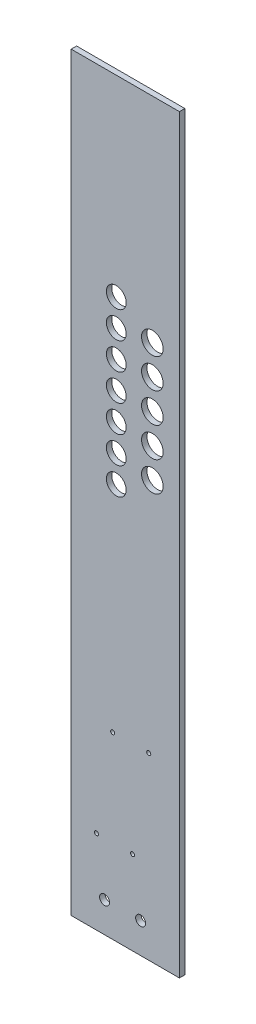
ISO-10303-21;
HEADER;
FILE_DESCRIPTION(('STEP AP214'),'2;1');
FILE_NAME('part.step','',(''),(''),'','','');
FILE_SCHEMA(('AUTOMOTIVE_DESIGN { 1 0 10303 214 1 1 1 1 }'));
ENDSEC;
DATA;
#1=APPLICATION_CONTEXT('core data for automotive mechanical design processes');
#2=APPLICATION_PROTOCOL_DEFINITION('international standard','automotive_design',2000,#1);
#3=PRODUCT_CONTEXT('',#1,'mechanical');
#4=PRODUCT('Part','Part','',(#3));
#5=PRODUCT_RELATED_PRODUCT_CATEGORY('part','',(#4));
#6=PRODUCT_DEFINITION_FORMATION('','',#4);
#7=PRODUCT_DEFINITION_CONTEXT('part definition',#1,'design');
#8=PRODUCT_DEFINITION('design','',#6,#7);
#9=PRODUCT_DEFINITION_SHAPE('','',#8);
#10=(LENGTH_UNIT() NAMED_UNIT(*) SI_UNIT(.MILLI.,.METRE.));
#11=(NAMED_UNIT(*) PLANE_ANGLE_UNIT() SI_UNIT($,.RADIAN.));
#12=(NAMED_UNIT(*) SI_UNIT($,.STERADIAN.) SOLID_ANGLE_UNIT());
#13=UNCERTAINTY_MEASURE_WITH_UNIT(LENGTH_MEASURE(1.E-05),#10,'distance_accuracy_value','');
#14=(GEOMETRIC_REPRESENTATION_CONTEXT(3) GLOBAL_UNCERTAINTY_ASSIGNED_CONTEXT((#13)) GLOBAL_UNIT_ASSIGNED_CONTEXT((#10,
#11,#12)) REPRESENTATION_CONTEXT('',''));
#15=CARTESIAN_POINT('',(0.,0.,0.));
#16=DIRECTION('',(0.,0.,1.));
#17=DIRECTION('',(1.,0.,0.));
#18=AXIS2_PLACEMENT_3D('',#15,#16,#17);
#19=CARTESIAN_POINT('',(60.,-416.,6.));
#20=DIRECTION('',(-1.,0.,0.));
#21=DIRECTION('',(0.,0.,1.));
#22=AXIS2_PLACEMENT_3D('',#19,#20,#21);
#23=PLANE('',#22);
#24=DIRECTION('',(0.,1.,0.));
#25=VECTOR('',#24,1.);
#26=CARTESIAN_POINT('',(60.,-416.,0.));
#27=LINE('',#26,#25);
#28=CARTESIAN_POINT('',(60.,-416.,0.));
#29=VERTEX_POINT('',#28);
#30=CARTESIAN_POINT('',(60.,416.,0.));
#31=VERTEX_POINT('',#30);
#32=EDGE_CURVE('E102',#29,#31,#27,.T.);
#33=ORIENTED_EDGE('',*,*,#32,.T.);
#34=DIRECTION('',(0.,0.,-1.));
#35=VECTOR('',#34,1.);
#36=CARTESIAN_POINT('',(60.,416.,6.));
#37=LINE('',#36,#35);
#38=CARTESIAN_POINT('',(60.,416.,6.));
#39=VERTEX_POINT('',#38);
#40=EDGE_CURVE('E93',#39,#31,#37,.T.);
#41=ORIENTED_EDGE('',*,*,#40,.F.);
#42=DIRECTION('',(0.,1.,0.));
#43=VECTOR('',#42,1.);
#44=CARTESIAN_POINT('',(60.,-416.,6.));
#45=LINE('',#44,#43);
#46=CARTESIAN_POINT('',(60.,-416.,6.));
#47=VERTEX_POINT('',#46);
#48=EDGE_CURVE('E87',#47,#39,#45,.T.);
#49=ORIENTED_EDGE('',*,*,#48,.F.);
#50=DIRECTION('',(0.,0.,-1.));
#51=VECTOR('',#50,1.);
#52=CARTESIAN_POINT('',(60.,-416.,6.));
#53=LINE('',#52,#51);
#54=EDGE_CURVE('E98',#47,#29,#53,.T.);
#55=ORIENTED_EDGE('',*,*,#54,.T.);
#56=EDGE_LOOP('',(#33,#41,#49,#55));
#57=FACE_BOUND('',#56,.T.);
#58=ADVANCED_FACE('F33',(#57),#23,.F.);
#59=CARTESIAN_POINT('',(-60.,416.,6.));
#60=DIRECTION('',(0.,-1.,0.));
#61=DIRECTION('',(0.,0.,-1.));
#62=AXIS2_PLACEMENT_3D('',#59,#60,#61);
#63=PLANE('',#62);
#64=DIRECTION('',(-1.,0.,0.));
#65=VECTOR('',#64,1.);
#66=CARTESIAN_POINT('',(-60.,416.,0.));
#67=LINE('',#66,#65);
#68=CARTESIAN_POINT('',(-60.,416.,0.));
#69=VERTEX_POINT('',#68);
#70=EDGE_CURVE('E92',#31,#69,#67,.T.);
#71=ORIENTED_EDGE('',*,*,#70,.T.);
#72=DIRECTION('',(0.,0.,-1.));
#73=VECTOR('',#72,1.);
#74=CARTESIAN_POINT('',(-60.,416.,6.));
#75=LINE('',#74,#73);
#76=CARTESIAN_POINT('',(-60.,416.,6.));
#77=VERTEX_POINT('',#76);
#78=EDGE_CURVE('E90',#77,#69,#75,.T.);
#79=ORIENTED_EDGE('',*,*,#78,.F.);
#80=DIRECTION('',(-1.,0.,0.));
#81=VECTOR('',#80,1.);
#82=CARTESIAN_POINT('',(-60.,416.,6.));
#83=LINE('',#82,#81);
#84=EDGE_CURVE('E81',#39,#77,#83,.T.);
#85=ORIENTED_EDGE('',*,*,#84,.F.);
#86=ORIENTED_EDGE('',*,*,#40,.T.);
#87=EDGE_LOOP('',(#71,#79,#85,#86));
#88=FACE_BOUND('',#87,.T.);
#89=ADVANCED_FACE('F91',(#88),#63,.F.);
#90=CARTESIAN_POINT('',(-60.,-416.,6.));
#91=DIRECTION('',(1.,0.,0.));
#92=DIRECTION('',(0.,0.,-1.));
#93=AXIS2_PLACEMENT_3D('',#90,#91,#92);
#94=PLANE('',#93);
#95=DIRECTION('',(0.,-1.,0.));
#96=VECTOR('',#95,1.);
#97=CARTESIAN_POINT('',(-60.,-416.,0.));
#98=LINE('',#97,#96);
#99=CARTESIAN_POINT('',(-60.,-416.,0.));
#100=VERTEX_POINT('',#99);
#101=EDGE_CURVE('E67',#69,#100,#98,.T.);
#102=ORIENTED_EDGE('',*,*,#101,.T.);
#103=DIRECTION('',(0.,0.,-1.));
#104=VECTOR('',#103,1.);
#105=CARTESIAN_POINT('',(-60.,-416.,6.));
#106=LINE('',#105,#104);
#107=CARTESIAN_POINT('',(-60.,-416.,6.));
#108=VERTEX_POINT('',#107);
#109=EDGE_CURVE('E94',#108,#100,#106,.T.);
#110=ORIENTED_EDGE('',*,*,#109,.F.);
#111=DIRECTION('',(0.,-1.,0.));
#112=VECTOR('',#111,1.);
#113=CARTESIAN_POINT('',(-60.,-416.,6.));
#114=LINE('',#113,#112);
#115=EDGE_CURVE('E85',#77,#108,#114,.T.);
#116=ORIENTED_EDGE('',*,*,#115,.F.);
#117=ORIENTED_EDGE('',*,*,#78,.T.);
#118=EDGE_LOOP('',(#102,#110,#116,#117));
#119=FACE_BOUND('',#118,.T.);
#120=ADVANCED_FACE('F96',(#119),#94,.F.);
#121=CARTESIAN_POINT('',(-60.,-416.,6.));
#122=DIRECTION('',(0.,1.,0.));
#123=DIRECTION('',(0.,0.,1.));
#124=AXIS2_PLACEMENT_3D('',#121,#122,#123);
#125=PLANE('',#124);
#126=DIRECTION('',(1.,0.,0.));
#127=VECTOR('',#126,1.);
#128=CARTESIAN_POINT('',(-60.,-416.,0.));
#129=LINE('',#128,#127);
#130=EDGE_CURVE('E73',#100,#29,#129,.T.);
#131=ORIENTED_EDGE('',*,*,#130,.T.);
#132=ORIENTED_EDGE('',*,*,#54,.F.);
#133=DIRECTION('',(1.,0.,0.));
#134=VECTOR('',#133,1.);
#135=CARTESIAN_POINT('',(-60.,-416.,6.));
#136=LINE('',#135,#134);
#137=EDGE_CURVE('E50',#108,#47,#136,.T.);
#138=ORIENTED_EDGE('',*,*,#137,.F.);
#139=ORIENTED_EDGE('',*,*,#109,.T.);
#140=EDGE_LOOP('',(#131,#132,#138,#139));
#141=FACE_BOUND('',#140,.T.);
#142=ADVANCED_FACE('F152',(#141),#125,.F.);
#143=CARTESIAN_POINT('',(0.,0.,6.));
#144=DIRECTION('',(0.,0.,-1.));
#145=DIRECTION('',(-1.,0.,0.));
#146=AXIS2_PLACEMENT_3D('',#143,#144,#145);
#147=PLANE('',#146);
#148=CARTESIAN_POINT('',(-9.99999999999998,83.,6.));
#149=DIRECTION('',(0.,0.,1.));
#150=DIRECTION('',(1.,0.,0.));
#151=AXIS2_PLACEMENT_3D('',#148,#149,#150);
#152=CIRCLE('',#151,11.);
#153=CARTESIAN_POINT('',(1.00000000000001,83.,6.));
#154=VERTEX_POINT('',#153);
#155=EDGE_CURVE('E323',#154,#154,#152,.T.);
#156=ORIENTED_EDGE('',*,*,#155,.F.);
#157=EDGE_LOOP('',(#156));
#158=FACE_BOUND('',#157,.T.);
#159=CARTESIAN_POINT('',(30.0000000000001,80.,6.));
#160=DIRECTION('',(0.,0.,1.));
#161=DIRECTION('',(1.,0.,0.));
#162=AXIS2_PLACEMENT_3D('',#159,#160,#161);
#163=CIRCLE('',#162,12.);
#164=CARTESIAN_POINT('',(42.0000000000001,80.,6.));
#165=VERTEX_POINT('',#164);
#166=EDGE_CURVE('E317',#165,#165,#163,.T.);
#167=ORIENTED_EDGE('',*,*,#166,.F.);
#168=EDGE_LOOP('',(#167));
#169=FACE_BOUND('',#168,.T.);
#170=CARTESIAN_POINT('',(30.0000000000001,146.,6.));
#171=DIRECTION('',(0.,0.,1.));
#172=DIRECTION('',(1.,0.,0.));
#173=AXIS2_PLACEMENT_3D('',#170,#171,#172);
#174=CIRCLE('',#173,12.);
#175=CARTESIAN_POINT('',(42.0000000000001,146.,6.));
#176=VERTEX_POINT('',#175);
#177=EDGE_CURVE('E311',#176,#176,#174,.T.);
#178=ORIENTED_EDGE('',*,*,#177,.F.);
#179=EDGE_LOOP('',(#178));
#180=FACE_BOUND('',#179,.T.);
#181=CARTESIAN_POINT('',(-9.99999999999998,143.,6.));
#182=DIRECTION('',(0.,0.,1.));
#183=DIRECTION('',(1.,0.,0.));
#184=AXIS2_PLACEMENT_3D('',#181,#182,#183);
#185=CIRCLE('',#184,11.);
#186=CARTESIAN_POINT('',(1.00000000000001,143.,6.));
#187=VERTEX_POINT('',#186);
#188=EDGE_CURVE('E305',#187,#187,#185,.T.);
#189=ORIENTED_EDGE('',*,*,#188,.F.);
#190=EDGE_LOOP('',(#189));
#191=FACE_BOUND('',#190,.T.);
#192=CARTESIAN_POINT('',(30.0000000000001,113.,6.));
#193=DIRECTION('',(0.,0.,1.));
#194=DIRECTION('',(1.,0.,0.));
#195=AXIS2_PLACEMENT_3D('',#192,#193,#194);
#196=CIRCLE('',#195,12.);
#197=CARTESIAN_POINT('',(42.0000000000001,113.,6.));
#198=VERTEX_POINT('',#197);
#199=EDGE_CURVE('E302',#198,#198,#196,.T.);
#200=ORIENTED_EDGE('',*,*,#199,.F.);
#201=EDGE_LOOP('',(#200));
#202=FACE_BOUND('',#201,.T.);
#203=CARTESIAN_POINT('',(-9.99999999999998,113.,6.));
#204=DIRECTION('',(0.,0.,1.));
#205=DIRECTION('',(1.,0.,0.));
#206=AXIS2_PLACEMENT_3D('',#203,#204,#205);
#207=CIRCLE('',#206,11.);
#208=CARTESIAN_POINT('',(1.00000000000001,113.,6.));
#209=VERTEX_POINT('',#208);
#210=EDGE_CURVE('E296',#209,#209,#207,.T.);
#211=ORIENTED_EDGE('',*,*,#210,.F.);
#212=EDGE_LOOP('',(#211));
#213=FACE_BOUND('',#212,.T.);
#214=CARTESIAN_POINT('',(26.000000000195,-217.000000000244,6.));
#215=DIRECTION('',(0.,0.,1.));
#216=DIRECTION('',(1.,0.,0.));
#217=AXIS2_PLACEMENT_3D('',#214,#215,#216);
#218=CIRCLE('',#217,2.25);
#219=CARTESIAN_POINT('',(28.250000000195,-217.000000000244,6.));
#220=VERTEX_POINT('',#219);
#221=EDGE_CURVE('E290',#220,#220,#218,.T.);
#222=ORIENTED_EDGE('',*,*,#221,.F.);
#223=EDGE_LOOP('',(#222));
#224=FACE_BOUND('',#223,.T.);
#225=CARTESIAN_POINT('',(8.00000000019505,-323.000000000244,6.));
#226=DIRECTION('',(0.,0.,1.));
#227=DIRECTION('',(1.,0.,0.));
#228=AXIS2_PLACEMENT_3D('',#225,#226,#227);
#229=CIRCLE('',#228,2.25);
#230=CARTESIAN_POINT('',(10.2500000001951,-323.000000000244,6.));
#231=VERTEX_POINT('',#230);
#232=EDGE_CURVE('E284',#231,#231,#229,.T.);
#233=ORIENTED_EDGE('',*,*,#232,.F.);
#234=EDGE_LOOP('',(#233));
#235=FACE_BOUND('',#234,.T.);
#236=CARTESIAN_POINT('',(-31.9999999998049,-323.000000000244,6.));
#237=DIRECTION('',(0.,0.,1.));
#238=DIRECTION('',(1.,0.,0.));
#239=AXIS2_PLACEMENT_3D('',#236,#237,#238);
#240=CIRCLE('',#239,2.25);
#241=CARTESIAN_POINT('',(-29.7499999998049,-323.000000000244,6.));
#242=VERTEX_POINT('',#241);
#243=EDGE_CURVE('E278',#242,#242,#240,.T.);
#244=ORIENTED_EDGE('',*,*,#243,.F.);
#245=EDGE_LOOP('',(#244));
#246=FACE_BOUND('',#245,.T.);
#247=CARTESIAN_POINT('',(-13.999999999805,-217.000000000244,6.));
#248=DIRECTION('',(0.,0.,1.));
#249=DIRECTION('',(1.,0.,0.));
#250=AXIS2_PLACEMENT_3D('',#247,#248,#249);
#251=CIRCLE('',#250,2.25);
#252=CARTESIAN_POINT('',(-11.749999999805,-217.000000000244,6.));
#253=VERTEX_POINT('',#252);
#254=EDGE_CURVE('E272',#253,#253,#251,.T.);
#255=ORIENTED_EDGE('',*,*,#254,.F.);
#256=EDGE_LOOP('',(#255));
#257=FACE_BOUND('',#256,.T.);
#258=CARTESIAN_POINT('',(17.000000000195,-382.348938989168,6.));
#259=DIRECTION('',(0.,0.,1.));
#260=DIRECTION('',(1.,0.,0.));
#261=AXIS2_PLACEMENT_3D('',#258,#259,#260);
#262=CIRCLE('',#261,5.5);
#263=CARTESIAN_POINT('',(22.500000000195,-382.348938989168,6.));
#264=VERTEX_POINT('',#263);
#265=EDGE_CURVE('E264',#264,#264,#262,.T.);
#266=ORIENTED_EDGE('',*,*,#265,.F.);
#267=EDGE_LOOP('',(#266));
#268=FACE_BOUND('',#267,.T.);
#269=CARTESIAN_POINT('',(-22.999999999805,-382.348938989168,6.));
#270=DIRECTION('',(0.,0.,1.));
#271=DIRECTION('',(1.,0.,0.));
#272=AXIS2_PLACEMENT_3D('',#269,#270,#271);
#273=CIRCLE('',#272,5.5);
#274=CARTESIAN_POINT('',(-17.499999999805,-382.348938989168,6.));
#275=VERTEX_POINT('',#274);
#276=EDGE_CURVE('E258',#275,#275,#273,.T.);
#277=ORIENTED_EDGE('',*,*,#276,.F.);
#278=EDGE_LOOP('',(#277));
#279=FACE_BOUND('',#278,.T.);
#280=ORIENTED_EDGE('',*,*,#48,.T.);
#281=ORIENTED_EDGE('',*,*,#84,.T.);
#282=ORIENTED_EDGE('',*,*,#115,.T.);
#283=ORIENTED_EDGE('',*,*,#137,.T.);
#284=EDGE_LOOP('',(#280,#281,#282,#283));
#285=FACE_BOUND('',#284,.T.);
#286=CARTESIAN_POINT('',(-9.99999999999998,173.,6.));
#287=DIRECTION('',(0.,0.,1.));
#288=DIRECTION('',(1.,0.,0.));
#289=AXIS2_PLACEMENT_3D('',#286,#287,#288);
#290=CIRCLE('',#289,11.);
#291=CARTESIAN_POINT('',(1.00000000000001,173.,6.));
#292=VERTEX_POINT('',#291);
#293=EDGE_CURVE('E115',#292,#292,#290,.T.);
#294=ORIENTED_EDGE('',*,*,#293,.F.);
#295=EDGE_LOOP('',(#294));
#296=FACE_BOUND('',#295,.T.);
#297=CARTESIAN_POINT('',(-9.99999999999998,203.,6.));
#298=DIRECTION('',(0.,0.,1.));
#299=DIRECTION('',(1.,0.,0.));
#300=AXIS2_PLACEMENT_3D('',#297,#298,#299);
#301=CIRCLE('',#300,11.);
#302=CARTESIAN_POINT('',(1.00000000000001,203.,6.));
#303=VERTEX_POINT('',#302);
#304=EDGE_CURVE('E121',#303,#303,#301,.T.);
#305=ORIENTED_EDGE('',*,*,#304,.F.);
#306=EDGE_LOOP('',(#305));
#307=FACE_BOUND('',#306,.T.);
#308=CARTESIAN_POINT('',(30.0000000000001,179.,6.));
#309=DIRECTION('',(0.,0.,1.));
#310=DIRECTION('',(1.,0.,0.));
#311=AXIS2_PLACEMENT_3D('',#308,#309,#310);
#312=CIRCLE('',#311,12.);
#313=CARTESIAN_POINT('',(42.0000000000001,179.,6.));
#314=VERTEX_POINT('',#313);
#315=EDGE_CURVE('E127',#314,#314,#312,.T.);
#316=ORIENTED_EDGE('',*,*,#315,.F.);
#317=EDGE_LOOP('',(#316));
#318=FACE_BOUND('',#317,.T.);
#319=CARTESIAN_POINT('',(30.0000000000001,47.,6.));
#320=DIRECTION('',(0.,0.,1.));
#321=DIRECTION('',(1.,0.,0.));
#322=AXIS2_PLACEMENT_3D('',#319,#320,#321);
#323=CIRCLE('',#322,12.);
#324=CARTESIAN_POINT('',(42.0000000000001,47.,6.));
#325=VERTEX_POINT('',#324);
#326=EDGE_CURVE('E133',#325,#325,#323,.T.);
#327=ORIENTED_EDGE('',*,*,#326,.F.);
#328=EDGE_LOOP('',(#327));
#329=FACE_BOUND('',#328,.T.);
#330=CARTESIAN_POINT('',(-9.99999999999998,53.,6.));
#331=DIRECTION('',(0.,0.,1.));
#332=DIRECTION('',(1.,0.,0.));
#333=AXIS2_PLACEMENT_3D('',#330,#331,#332);
#334=CIRCLE('',#333,11.);
#335=CARTESIAN_POINT('',(1.00000000000001,53.,6.));
#336=VERTEX_POINT('',#335);
#337=EDGE_CURVE('E139',#336,#336,#334,.T.);
#338=ORIENTED_EDGE('',*,*,#337,.F.);
#339=EDGE_LOOP('',(#338));
#340=FACE_BOUND('',#339,.T.);
#341=CARTESIAN_POINT('',(-9.99999999999998,23.,6.));
#342=DIRECTION('',(0.,0.,1.));
#343=DIRECTION('',(1.,0.,0.));
#344=AXIS2_PLACEMENT_3D('',#341,#342,#343);
#345=CIRCLE('',#344,11.);
#346=CARTESIAN_POINT('',(1.00000000000001,23.,6.));
#347=VERTEX_POINT('',#346);
#348=EDGE_CURVE('E11',#347,#347,#345,.T.);
#349=ORIENTED_EDGE('',*,*,#348,.F.);
#350=EDGE_LOOP('',(#349));
#351=FACE_BOUND('',#350,.T.);
#352=ADVANCED_FACE('F82',(#158,#169,#180,#191,#202,#213,#224,#235,#246,#257,#268,#279,#285,#296,
#307,#318,#329,#340,#351),#147,.F.);
#353=CARTESIAN_POINT('',(0.,0.,0.));
#354=DIRECTION('',(0.,0.,-1.));
#355=DIRECTION('',(-1.,0.,0.));
#356=AXIS2_PLACEMENT_3D('',#353,#354,#355);
#357=PLANE('',#356);
#358=CARTESIAN_POINT('',(-9.99999999999998,83.,0.));
#359=DIRECTION('',(0.,0.,1.));
#360=DIRECTION('',(1.,0.,0.));
#361=AXIS2_PLACEMENT_3D('',#358,#359,#360);
#362=CIRCLE('',#361,11.);
#363=CARTESIAN_POINT('',(1.00000000000001,83.,0.));
#364=VERTEX_POINT('',#363);
#365=EDGE_CURVE('E326',#364,#364,#362,.T.);
#366=ORIENTED_EDGE('',*,*,#365,.T.);
#367=EDGE_LOOP('',(#366));
#368=FACE_BOUND('',#367,.T.);
#369=CARTESIAN_POINT('',(30.0000000000001,80.,0.));
#370=DIRECTION('',(0.,0.,1.));
#371=DIRECTION('',(1.,0.,0.));
#372=AXIS2_PLACEMENT_3D('',#369,#370,#371);
#373=CIRCLE('',#372,12.);
#374=CARTESIAN_POINT('',(42.0000000000001,80.,0.));
#375=VERTEX_POINT('',#374);
#376=EDGE_CURVE('E320',#375,#375,#373,.T.);
#377=ORIENTED_EDGE('',*,*,#376,.T.);
#378=EDGE_LOOP('',(#377));
#379=FACE_BOUND('',#378,.T.);
#380=CARTESIAN_POINT('',(30.0000000000001,146.,0.));
#381=DIRECTION('',(0.,0.,1.));
#382=DIRECTION('',(1.,0.,0.));
#383=AXIS2_PLACEMENT_3D('',#380,#381,#382);
#384=CIRCLE('',#383,12.);
#385=CARTESIAN_POINT('',(42.0000000000001,146.,0.));
#386=VERTEX_POINT('',#385);
#387=EDGE_CURVE('E314',#386,#386,#384,.T.);
#388=ORIENTED_EDGE('',*,*,#387,.T.);
#389=EDGE_LOOP('',(#388));
#390=FACE_BOUND('',#389,.T.);
#391=CARTESIAN_POINT('',(-9.99999999999998,143.,0.));
#392=DIRECTION('',(0.,0.,1.));
#393=DIRECTION('',(1.,0.,0.));
#394=AXIS2_PLACEMENT_3D('',#391,#392,#393);
#395=CIRCLE('',#394,11.);
#396=CARTESIAN_POINT('',(1.00000000000001,143.,0.));
#397=VERTEX_POINT('',#396);
#398=EDGE_CURVE('E308',#397,#397,#395,.T.);
#399=ORIENTED_EDGE('',*,*,#398,.T.);
#400=EDGE_LOOP('',(#399));
#401=FACE_BOUND('',#400,.T.);
#402=CARTESIAN_POINT('',(30.0000000000001,113.,0.));
#403=DIRECTION('',(0.,0.,1.));
#404=DIRECTION('',(1.,0.,0.));
#405=AXIS2_PLACEMENT_3D('',#402,#403,#404);
#406=CIRCLE('',#405,12.);
#407=CARTESIAN_POINT('',(42.0000000000001,113.,0.));
#408=VERTEX_POINT('',#407);
#409=EDGE_CURVE('E299',#408,#408,#406,.T.);
#410=ORIENTED_EDGE('',*,*,#409,.T.);
#411=EDGE_LOOP('',(#410));
#412=FACE_BOUND('',#411,.T.);
#413=CARTESIAN_POINT('',(-9.99999999999998,113.,0.));
#414=DIRECTION('',(0.,0.,1.));
#415=DIRECTION('',(1.,0.,0.));
#416=AXIS2_PLACEMENT_3D('',#413,#414,#415);
#417=CIRCLE('',#416,11.);
#418=CARTESIAN_POINT('',(1.00000000000001,113.,0.));
#419=VERTEX_POINT('',#418);
#420=EDGE_CURVE('E293',#419,#419,#417,.T.);
#421=ORIENTED_EDGE('',*,*,#420,.T.);
#422=EDGE_LOOP('',(#421));
#423=FACE_BOUND('',#422,.T.);
#424=CARTESIAN_POINT('',(26.000000000195,-217.000000000244,0.));
#425=DIRECTION('',(0.,0.,1.));
#426=DIRECTION('',(1.,0.,0.));
#427=AXIS2_PLACEMENT_3D('',#424,#425,#426);
#428=CIRCLE('',#427,2.25);
#429=CARTESIAN_POINT('',(28.250000000195,-217.000000000244,0.));
#430=VERTEX_POINT('',#429);
#431=EDGE_CURVE('E287',#430,#430,#428,.T.);
#432=ORIENTED_EDGE('',*,*,#431,.T.);
#433=EDGE_LOOP('',(#432));
#434=FACE_BOUND('',#433,.T.);
#435=CARTESIAN_POINT('',(8.00000000019505,-323.000000000244,0.));
#436=DIRECTION('',(0.,0.,1.));
#437=DIRECTION('',(1.,0.,0.));
#438=AXIS2_PLACEMENT_3D('',#435,#436,#437);
#439=CIRCLE('',#438,2.25);
#440=CARTESIAN_POINT('',(10.2500000001951,-323.000000000244,0.));
#441=VERTEX_POINT('',#440);
#442=EDGE_CURVE('E281',#441,#441,#439,.T.);
#443=ORIENTED_EDGE('',*,*,#442,.T.);
#444=EDGE_LOOP('',(#443));
#445=FACE_BOUND('',#444,.T.);
#446=CARTESIAN_POINT('',(-31.9999999998049,-323.000000000244,0.));
#447=DIRECTION('',(0.,0.,1.));
#448=DIRECTION('',(1.,0.,0.));
#449=AXIS2_PLACEMENT_3D('',#446,#447,#448);
#450=CIRCLE('',#449,2.25);
#451=CARTESIAN_POINT('',(-29.7499999998049,-323.000000000244,0.));
#452=VERTEX_POINT('',#451);
#453=EDGE_CURVE('E275',#452,#452,#450,.T.);
#454=ORIENTED_EDGE('',*,*,#453,.T.);
#455=EDGE_LOOP('',(#454));
#456=FACE_BOUND('',#455,.T.);
#457=CARTESIAN_POINT('',(-13.999999999805,-217.000000000244,0.));
#458=DIRECTION('',(0.,0.,1.));
#459=DIRECTION('',(1.,0.,0.));
#460=AXIS2_PLACEMENT_3D('',#457,#458,#459);
#461=CIRCLE('',#460,2.25);
#462=CARTESIAN_POINT('',(-11.749999999805,-217.000000000244,0.));
#463=VERTEX_POINT('',#462);
#464=EDGE_CURVE('E269',#463,#463,#461,.T.);
#465=ORIENTED_EDGE('',*,*,#464,.T.);
#466=EDGE_LOOP('',(#465));
#467=FACE_BOUND('',#466,.T.);
#468=CARTESIAN_POINT('',(17.000000000195,-382.348938989168,0.));
#469=DIRECTION('',(0.,0.,1.));
#470=DIRECTION('',(1.,0.,0.));
#471=AXIS2_PLACEMENT_3D('',#468,#469,#470);
#472=CIRCLE('',#471,5.5);
#473=CARTESIAN_POINT('',(22.500000000195,-382.348938989168,0.));
#474=VERTEX_POINT('',#473);
#475=EDGE_CURVE('E260',#474,#474,#472,.T.);
#476=ORIENTED_EDGE('',*,*,#475,.T.);
#477=EDGE_LOOP('',(#476));
#478=FACE_BOUND('',#477,.T.);
#479=CARTESIAN_POINT('',(-22.999999999805,-382.348938989168,0.));
#480=DIRECTION('',(0.,0.,1.));
#481=DIRECTION('',(1.,0.,0.));
#482=AXIS2_PLACEMENT_3D('',#479,#480,#481);
#483=CIRCLE('',#482,5.5);
#484=CARTESIAN_POINT('',(-17.499999999805,-382.348938989168,0.));
#485=VERTEX_POINT('',#484);
#486=EDGE_CURVE('E105',#485,#485,#483,.T.);
#487=ORIENTED_EDGE('',*,*,#486,.T.);
#488=EDGE_LOOP('',(#487));
#489=FACE_BOUND('',#488,.T.);
#490=ORIENTED_EDGE('',*,*,#32,.F.);
#491=ORIENTED_EDGE('',*,*,#130,.F.);
#492=ORIENTED_EDGE('',*,*,#101,.F.);
#493=ORIENTED_EDGE('',*,*,#70,.F.);
#494=EDGE_LOOP('',(#490,#491,#492,#493));
#495=FACE_BOUND('',#494,.T.);
#496=CARTESIAN_POINT('',(-9.99999999999998,173.,0.));
#497=DIRECTION('',(0.,0.,1.));
#498=DIRECTION('',(1.,0.,0.));
#499=AXIS2_PLACEMENT_3D('',#496,#497,#498);
#500=CIRCLE('',#499,11.);
#501=CARTESIAN_POINT('',(1.00000000000001,173.,0.));
#502=VERTEX_POINT('',#501);
#503=EDGE_CURVE('E112',#502,#502,#500,.T.);
#504=ORIENTED_EDGE('',*,*,#503,.T.);
#505=EDGE_LOOP('',(#504));
#506=FACE_BOUND('',#505,.T.);
#507=CARTESIAN_POINT('',(-9.99999999999998,203.,0.));
#508=DIRECTION('',(0.,0.,1.));
#509=DIRECTION('',(1.,0.,0.));
#510=AXIS2_PLACEMENT_3D('',#507,#508,#509);
#511=CIRCLE('',#510,11.);
#512=CARTESIAN_POINT('',(1.00000000000001,203.,0.));
#513=VERTEX_POINT('',#512);
#514=EDGE_CURVE('E118',#513,#513,#511,.T.);
#515=ORIENTED_EDGE('',*,*,#514,.T.);
#516=EDGE_LOOP('',(#515));
#517=FACE_BOUND('',#516,.T.);
#518=CARTESIAN_POINT('',(30.0000000000001,179.,0.));
#519=DIRECTION('',(0.,0.,1.));
#520=DIRECTION('',(1.,0.,0.));
#521=AXIS2_PLACEMENT_3D('',#518,#519,#520);
#522=CIRCLE('',#521,12.);
#523=CARTESIAN_POINT('',(42.0000000000001,179.,0.));
#524=VERTEX_POINT('',#523);
#525=EDGE_CURVE('E124',#524,#524,#522,.T.);
#526=ORIENTED_EDGE('',*,*,#525,.T.);
#527=EDGE_LOOP('',(#526));
#528=FACE_BOUND('',#527,.T.);
#529=CARTESIAN_POINT('',(30.0000000000001,47.,0.));
#530=DIRECTION('',(0.,0.,1.));
#531=DIRECTION('',(1.,0.,0.));
#532=AXIS2_PLACEMENT_3D('',#529,#530,#531);
#533=CIRCLE('',#532,12.);
#534=CARTESIAN_POINT('',(42.0000000000001,47.,0.));
#535=VERTEX_POINT('',#534);
#536=EDGE_CURVE('E130',#535,#535,#533,.T.);
#537=ORIENTED_EDGE('',*,*,#536,.T.);
#538=EDGE_LOOP('',(#537));
#539=FACE_BOUND('',#538,.T.);
#540=CARTESIAN_POINT('',(-9.99999999999998,53.,0.));
#541=DIRECTION('',(0.,0.,1.));
#542=DIRECTION('',(1.,0.,0.));
#543=AXIS2_PLACEMENT_3D('',#540,#541,#542);
#544=CIRCLE('',#543,11.);
#545=CARTESIAN_POINT('',(1.00000000000001,53.,0.));
#546=VERTEX_POINT('',#545);
#547=EDGE_CURVE('E136',#546,#546,#544,.T.);
#548=ORIENTED_EDGE('',*,*,#547,.T.);
#549=EDGE_LOOP('',(#548));
#550=FACE_BOUND('',#549,.T.);
#551=CARTESIAN_POINT('',(-9.99999999999998,23.,0.));
#552=DIRECTION('',(0.,0.,1.));
#553=DIRECTION('',(1.,0.,0.));
#554=AXIS2_PLACEMENT_3D('',#551,#552,#553);
#555=CIRCLE('',#554,11.);
#556=CARTESIAN_POINT('',(1.00000000000001,23.,0.));
#557=VERTEX_POINT('',#556);
#558=EDGE_CURVE('E42',#557,#557,#555,.T.);
#559=ORIENTED_EDGE('',*,*,#558,.T.);
#560=EDGE_LOOP('',(#559));
#561=FACE_BOUND('',#560,.T.);
#562=ADVANCED_FACE('F144',(#368,#379,#390,#401,#412,#423,#434,#445,#456,#467,#478,#489,#495,
#506,#517,#528,#539,#550,#561),#357,.T.);
#563=CARTESIAN_POINT('',(-22.999999999805,-382.348938989168,6.));
#564=DIRECTION('',(0.,0.,1.));
#565=DIRECTION('',(1.,0.,0.));
#566=AXIS2_PLACEMENT_3D('',#563,#564,#565);
#567=CYLINDRICAL_SURFACE('',#566,5.5);
#568=ORIENTED_EDGE('',*,*,#486,.F.);
#569=EDGE_LOOP('',(#568));
#570=FACE_BOUND('',#569,.T.);
#571=ORIENTED_EDGE('',*,*,#276,.T.);
#572=EDGE_LOOP('',(#571));
#573=FACE_BOUND('',#572,.T.);
#574=ADVANCED_FACE('F159',(#570,#573),#567,.F.);
#575=CARTESIAN_POINT('',(17.000000000195,-382.348938989168,6.));
#576=DIRECTION('',(0.,0.,1.));
#577=DIRECTION('',(1.,0.,0.));
#578=AXIS2_PLACEMENT_3D('',#575,#576,#577);
#579=CYLINDRICAL_SURFACE('',#578,5.5);
#580=ORIENTED_EDGE('',*,*,#475,.F.);
#581=EDGE_LOOP('',(#580));
#582=FACE_BOUND('',#581,.T.);
#583=ORIENTED_EDGE('',*,*,#265,.T.);
#584=EDGE_LOOP('',(#583));
#585=FACE_BOUND('',#584,.T.);
#586=ADVANCED_FACE('F244',(#582,#585),#579,.F.);
#587=CARTESIAN_POINT('',(-13.999999999805,-217.000000000244,6.));
#588=DIRECTION('',(0.,0.,1.));
#589=DIRECTION('',(1.,0.,0.));
#590=AXIS2_PLACEMENT_3D('',#587,#588,#589);
#591=CYLINDRICAL_SURFACE('',#590,2.25);
#592=ORIENTED_EDGE('',*,*,#464,.F.);
#593=EDGE_LOOP('',(#592));
#594=FACE_BOUND('',#593,.T.);
#595=ORIENTED_EDGE('',*,*,#254,.T.);
#596=EDGE_LOOP('',(#595));
#597=FACE_BOUND('',#596,.T.);
#598=ADVANCED_FACE('F240',(#594,#597),#591,.F.);
#599=CARTESIAN_POINT('',(-31.9999999998049,-323.000000000244,6.));
#600=DIRECTION('',(0.,0.,1.));
#601=DIRECTION('',(1.,0.,0.));
#602=AXIS2_PLACEMENT_3D('',#599,#600,#601);
#603=CYLINDRICAL_SURFACE('',#602,2.25);
#604=ORIENTED_EDGE('',*,*,#453,.F.);
#605=EDGE_LOOP('',(#604));
#606=FACE_BOUND('',#605,.T.);
#607=ORIENTED_EDGE('',*,*,#243,.T.);
#608=EDGE_LOOP('',(#607));
#609=FACE_BOUND('',#608,.T.);
#610=ADVANCED_FACE('F236',(#606,#609),#603,.F.);
#611=CARTESIAN_POINT('',(8.00000000019505,-323.000000000244,6.));
#612=DIRECTION('',(0.,0.,1.));
#613=DIRECTION('',(1.,0.,0.));
#614=AXIS2_PLACEMENT_3D('',#611,#612,#613);
#615=CYLINDRICAL_SURFACE('',#614,2.25);
#616=ORIENTED_EDGE('',*,*,#442,.F.);
#617=EDGE_LOOP('',(#616));
#618=FACE_BOUND('',#617,.T.);
#619=ORIENTED_EDGE('',*,*,#232,.T.);
#620=EDGE_LOOP('',(#619));
#621=FACE_BOUND('',#620,.T.);
#622=ADVANCED_FACE('F232',(#618,#621),#615,.F.);
#623=CARTESIAN_POINT('',(26.000000000195,-217.000000000244,6.));
#624=DIRECTION('',(0.,0.,1.));
#625=DIRECTION('',(1.,0.,0.));
#626=AXIS2_PLACEMENT_3D('',#623,#624,#625);
#627=CYLINDRICAL_SURFACE('',#626,2.25);
#628=ORIENTED_EDGE('',*,*,#431,.F.);
#629=EDGE_LOOP('',(#628));
#630=FACE_BOUND('',#629,.T.);
#631=ORIENTED_EDGE('',*,*,#221,.T.);
#632=EDGE_LOOP('',(#631));
#633=FACE_BOUND('',#632,.T.);
#634=ADVANCED_FACE('F228',(#630,#633),#627,.F.);
#635=CARTESIAN_POINT('',(-9.99999999999998,113.,6.));
#636=DIRECTION('',(0.,0.,1.));
#637=DIRECTION('',(1.,0.,0.));
#638=AXIS2_PLACEMENT_3D('',#635,#636,#637);
#639=CYLINDRICAL_SURFACE('',#638,11.);
#640=ORIENTED_EDGE('',*,*,#420,.F.);
#641=EDGE_LOOP('',(#640));
#642=FACE_BOUND('',#641,.T.);
#643=ORIENTED_EDGE('',*,*,#210,.T.);
#644=EDGE_LOOP('',(#643));
#645=FACE_BOUND('',#644,.T.);
#646=ADVANCED_FACE('F224',(#642,#645),#639,.F.);
#647=CARTESIAN_POINT('',(30.0000000000001,113.,6.));
#648=DIRECTION('',(0.,0.,1.));
#649=DIRECTION('',(1.,0.,0.));
#650=AXIS2_PLACEMENT_3D('',#647,#648,#649);
#651=CYLINDRICAL_SURFACE('',#650,12.);
#652=ORIENTED_EDGE('',*,*,#409,.F.);
#653=EDGE_LOOP('',(#652));
#654=FACE_BOUND('',#653,.T.);
#655=ORIENTED_EDGE('',*,*,#199,.T.);
#656=EDGE_LOOP('',(#655));
#657=FACE_BOUND('',#656,.T.);
#658=ADVANCED_FACE('F220',(#654,#657),#651,.F.);
#659=CARTESIAN_POINT('',(-9.99999999999998,143.,6.));
#660=DIRECTION('',(0.,0.,1.));
#661=DIRECTION('',(1.,0.,0.));
#662=AXIS2_PLACEMENT_3D('',#659,#660,#661);
#663=CYLINDRICAL_SURFACE('',#662,11.);
#664=ORIENTED_EDGE('',*,*,#398,.F.);
#665=EDGE_LOOP('',(#664));
#666=FACE_BOUND('',#665,.T.);
#667=ORIENTED_EDGE('',*,*,#188,.T.);
#668=EDGE_LOOP('',(#667));
#669=FACE_BOUND('',#668,.T.);
#670=ADVANCED_FACE('F180',(#666,#669),#663,.F.);
#671=CARTESIAN_POINT('',(-9.99999999999998,173.,6.));
#672=DIRECTION('',(0.,0.,1.));
#673=DIRECTION('',(1.,0.,0.));
#674=AXIS2_PLACEMENT_3D('',#671,#672,#673);
#675=CYLINDRICAL_SURFACE('',#674,11.);
#676=ORIENTED_EDGE('',*,*,#503,.F.);
#677=EDGE_LOOP('',(#676));
#678=FACE_BOUND('',#677,.T.);
#679=ORIENTED_EDGE('',*,*,#293,.T.);
#680=EDGE_LOOP('',(#679));
#681=FACE_BOUND('',#680,.T.);
#682=ADVANCED_FACE('F176',(#678,#681),#675,.F.);
#683=CARTESIAN_POINT('',(-9.99999999999998,203.,6.));
#684=DIRECTION('',(0.,0.,1.));
#685=DIRECTION('',(1.,0.,0.));
#686=AXIS2_PLACEMENT_3D('',#683,#684,#685);
#687=CYLINDRICAL_SURFACE('',#686,11.);
#688=ORIENTED_EDGE('',*,*,#514,.F.);
#689=EDGE_LOOP('',(#688));
#690=FACE_BOUND('',#689,.T.);
#691=ORIENTED_EDGE('',*,*,#304,.T.);
#692=EDGE_LOOP('',(#691));
#693=FACE_BOUND('',#692,.T.);
#694=ADVANCED_FACE('F179',(#690,#693),#687,.F.);
#695=CARTESIAN_POINT('',(30.0000000000001,146.,6.));
#696=DIRECTION('',(0.,0.,1.));
#697=DIRECTION('',(1.,0.,0.));
#698=AXIS2_PLACEMENT_3D('',#695,#696,#697);
#699=CYLINDRICAL_SURFACE('',#698,12.);
#700=ORIENTED_EDGE('',*,*,#387,.F.);
#701=EDGE_LOOP('',(#700));
#702=FACE_BOUND('',#701,.T.);
#703=ORIENTED_EDGE('',*,*,#177,.T.);
#704=EDGE_LOOP('',(#703));
#705=FACE_BOUND('',#704,.T.);
#706=ADVANCED_FACE('F184',(#702,#705),#699,.F.);
#707=CARTESIAN_POINT('',(30.0000000000001,179.,6.));
#708=DIRECTION('',(0.,0.,1.));
#709=DIRECTION('',(1.,0.,0.));
#710=AXIS2_PLACEMENT_3D('',#707,#708,#709);
#711=CYLINDRICAL_SURFACE('',#710,12.);
#712=ORIENTED_EDGE('',*,*,#525,.F.);
#713=EDGE_LOOP('',(#712));
#714=FACE_BOUND('',#713,.T.);
#715=ORIENTED_EDGE('',*,*,#315,.T.);
#716=EDGE_LOOP('',(#715));
#717=FACE_BOUND('',#716,.T.);
#718=ADVANCED_FACE('F186',(#714,#717),#711,.F.);
#719=CARTESIAN_POINT('',(30.0000000000001,80.,6.));
#720=DIRECTION('',(0.,0.,1.));
#721=DIRECTION('',(1.,0.,0.));
#722=AXIS2_PLACEMENT_3D('',#719,#720,#721);
#723=CYLINDRICAL_SURFACE('',#722,12.);
#724=ORIENTED_EDGE('',*,*,#376,.F.);
#725=EDGE_LOOP('',(#724));
#726=FACE_BOUND('',#725,.T.);
#727=ORIENTED_EDGE('',*,*,#166,.T.);
#728=EDGE_LOOP('',(#727));
#729=FACE_BOUND('',#728,.T.);
#730=ADVANCED_FACE('F189',(#726,#729),#723,.F.);
#731=CARTESIAN_POINT('',(30.0000000000001,47.,6.));
#732=DIRECTION('',(0.,0.,1.));
#733=DIRECTION('',(1.,0.,0.));
#734=AXIS2_PLACEMENT_3D('',#731,#732,#733);
#735=CYLINDRICAL_SURFACE('',#734,12.);
#736=ORIENTED_EDGE('',*,*,#536,.F.);
#737=EDGE_LOOP('',(#736));
#738=FACE_BOUND('',#737,.T.);
#739=ORIENTED_EDGE('',*,*,#326,.T.);
#740=EDGE_LOOP('',(#739));
#741=FACE_BOUND('',#740,.T.);
#742=ADVANCED_FACE('F191',(#738,#741),#735,.F.);
#743=CARTESIAN_POINT('',(-9.99999999999998,83.,6.));
#744=DIRECTION('',(0.,0.,1.));
#745=DIRECTION('',(1.,0.,0.));
#746=AXIS2_PLACEMENT_3D('',#743,#744,#745);
#747=CYLINDRICAL_SURFACE('',#746,11.);
#748=ORIENTED_EDGE('',*,*,#365,.F.);
#749=EDGE_LOOP('',(#748));
#750=FACE_BOUND('',#749,.T.);
#751=ORIENTED_EDGE('',*,*,#155,.T.);
#752=EDGE_LOOP('',(#751));
#753=FACE_BOUND('',#752,.T.);
#754=ADVANCED_FACE('F193',(#750,#753),#747,.F.);
#755=CARTESIAN_POINT('',(-9.99999999999998,53.,6.));
#756=DIRECTION('',(0.,0.,1.));
#757=DIRECTION('',(1.,0.,0.));
#758=AXIS2_PLACEMENT_3D('',#755,#756,#757);
#759=CYLINDRICAL_SURFACE('',#758,11.);
#760=ORIENTED_EDGE('',*,*,#547,.F.);
#761=EDGE_LOOP('',(#760));
#762=FACE_BOUND('',#761,.T.);
#763=ORIENTED_EDGE('',*,*,#337,.T.);
#764=EDGE_LOOP('',(#763));
#765=FACE_BOUND('',#764,.T.);
#766=ADVANCED_FACE('F148',(#762,#765),#759,.F.);
#767=CARTESIAN_POINT('',(-9.99999999999998,23.,6.));
#768=DIRECTION('',(0.,0.,1.));
#769=DIRECTION('',(1.,0.,0.));
#770=AXIS2_PLACEMENT_3D('',#767,#768,#769);
#771=CYLINDRICAL_SURFACE('',#770,11.);
#772=ORIENTED_EDGE('',*,*,#558,.F.);
#773=EDGE_LOOP('',(#772));
#774=FACE_BOUND('',#773,.T.);
#775=ORIENTED_EDGE('',*,*,#348,.T.);
#776=EDGE_LOOP('',(#775));
#777=FACE_BOUND('',#776,.T.);
#778=ADVANCED_FACE('F35',(#774,#777),#771,.F.);
#779=CLOSED_SHELL('',(#58,#89,#120,#142,#352,#562,#574,#586,#598,#610,#622,#634,#646,#658,#670,
#682,#694,#706,#718,#730,#742,#754,#766,#778));
#780=MANIFOLD_SOLID_BREP('B2',#779);
#781=ADVANCED_BREP_SHAPE_REPRESENTATION('',(#18,#780),#14);
#782=SHAPE_DEFINITION_REPRESENTATION(#9,#781);
ENDSEC;
END-ISO-10303-21;
